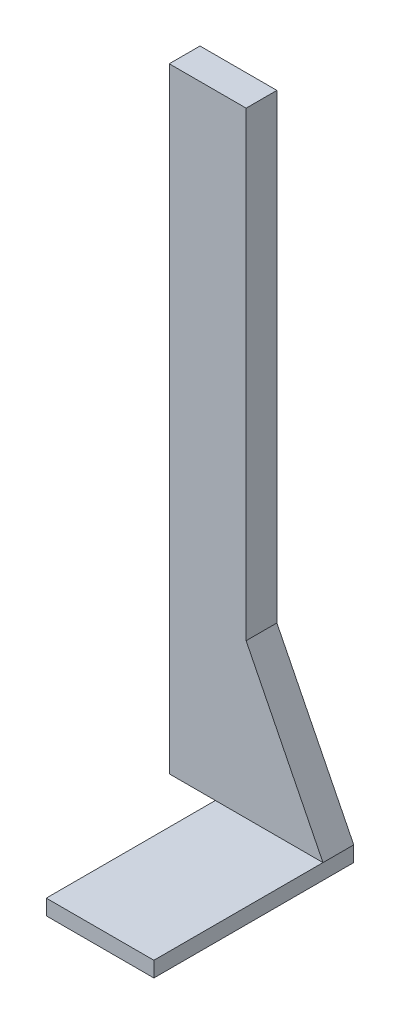
ISO-10303-21;
HEADER;
FILE_DESCRIPTION(('STEP AP214'),'2;1');
FILE_NAME('part.step','',(''),(''),'','','');
FILE_SCHEMA(('AUTOMOTIVE_DESIGN { 1 0 10303 214 1 1 1 1 }'));
ENDSEC;
DATA;
#1=APPLICATION_CONTEXT('core data for automotive mechanical design processes');
#2=APPLICATION_PROTOCOL_DEFINITION('international standard','automotive_design',2000,#1);
#3=PRODUCT_CONTEXT('',#1,'mechanical');
#4=PRODUCT('Part','Part','',(#3));
#5=PRODUCT_RELATED_PRODUCT_CATEGORY('part','',(#4));
#6=PRODUCT_DEFINITION_FORMATION('','',#4);
#7=PRODUCT_DEFINITION_CONTEXT('part definition',#1,'design');
#8=PRODUCT_DEFINITION('design','',#6,#7);
#9=PRODUCT_DEFINITION_SHAPE('','',#8);
#10=(LENGTH_UNIT() NAMED_UNIT(*) SI_UNIT(.MILLI.,.METRE.));
#11=(NAMED_UNIT(*) PLANE_ANGLE_UNIT() SI_UNIT($,.RADIAN.));
#12=(NAMED_UNIT(*) SI_UNIT($,.STERADIAN.) SOLID_ANGLE_UNIT());
#13=UNCERTAINTY_MEASURE_WITH_UNIT(LENGTH_MEASURE(1.E-05),#10,'distance_accuracy_value','');
#14=(GEOMETRIC_REPRESENTATION_CONTEXT(3) GLOBAL_UNCERTAINTY_ASSIGNED_CONTEXT((#13)) GLOBAL_UNIT_ASSIGNED_CONTEXT((#10,
#11,#12)) REPRESENTATION_CONTEXT('',''));
#15=CARTESIAN_POINT('',(0.,0.,0.));
#16=DIRECTION('',(0.,0.,1.));
#17=DIRECTION('',(1.,0.,0.));
#18=AXIS2_PLACEMENT_3D('',#15,#16,#17);
#19=CARTESIAN_POINT('',(0.,5.,0.));
#20=DIRECTION('',(-1.,0.,0.));
#21=DIRECTION('',(0.,0.,1.));
#22=AXIS2_PLACEMENT_3D('',#19,#20,#21);
#23=PLANE('',#22);
#24=DIRECTION('',(0.,0.,-1.));
#25=VECTOR('',#24,1.);
#26=CARTESIAN_POINT('',(0.,0.,0.));
#27=LINE('',#26,#25);
#28=CARTESIAN_POINT('',(0.,0.,65.));
#29=VERTEX_POINT('',#28);
#30=CARTESIAN_POINT('',(0.,0.,0.));
#31=VERTEX_POINT('',#30);
#32=EDGE_CURVE('E105',#29,#31,#27,.T.);
#33=ORIENTED_EDGE('',*,*,#32,.T.);
#34=DIRECTION('',(0.,-1.,0.));
#35=VECTOR('',#34,1.);
#36=CARTESIAN_POINT('',(0.,5.,0.));
#37=LINE('',#36,#35);
#38=CARTESIAN_POINT('',(0.,5.,0.));
#39=VERTEX_POINT('',#38);
#40=EDGE_CURVE('E11',#39,#31,#37,.T.);
#41=ORIENTED_EDGE('',*,*,#40,.F.);
#42=DIRECTION('',(0.,0.,-1.));
#43=VECTOR('',#42,1.);
#44=CARTESIAN_POINT('',(0.,5.,10.));
#45=LINE('',#44,#43);
#46=CARTESIAN_POINT('',(0.,5.,10.));
#47=VERTEX_POINT('',#46);
#48=EDGE_CURVE('E214',#47,#39,#45,.T.);
#49=ORIENTED_EDGE('',*,*,#48,.F.);
#50=DIRECTION('',(0.,0.,-1.));
#51=VECTOR('',#50,1.);
#52=CARTESIAN_POINT('',(0.,5.,0.));
#53=LINE('',#52,#51);
#54=CARTESIAN_POINT('',(0.,5.,65.));
#55=VERTEX_POINT('',#54);
#56=EDGE_CURVE('E99',#55,#47,#53,.T.);
#57=ORIENTED_EDGE('',*,*,#56,.F.);
#58=DIRECTION('',(0.,-1.,0.));
#59=VECTOR('',#58,1.);
#60=CARTESIAN_POINT('',(0.,5.,65.));
#61=LINE('',#60,#59);
#62=EDGE_CURVE('E91',#55,#29,#61,.T.);
#63=ORIENTED_EDGE('',*,*,#62,.T.);
#64=EDGE_LOOP('',(#33,#41,#49,#57,#63));
#65=FACE_BOUND('',#64,.T.);
#66=ADVANCED_FACE('F45',(#65),#23,.F.);
#67=CARTESIAN_POINT('',(0.,5.,0.));
#68=DIRECTION('',(0.,0.,1.));
#69=DIRECTION('',(1.,0.,0.));
#70=AXIS2_PLACEMENT_3D('',#67,#68,#69);
#71=PLANE('',#70);
#72=DIRECTION('',(-1.,0.,0.));
#73=VECTOR('',#72,1.);
#74=CARTESIAN_POINT('',(0.,0.,0.));
#75=LINE('',#74,#73);
#76=CARTESIAN_POINT('',(-35.,0.,0.));
#77=VERTEX_POINT('',#76);
#78=EDGE_CURVE('E110',#31,#77,#75,.T.);
#79=ORIENTED_EDGE('',*,*,#78,.T.);
#80=DIRECTION('',(0.,-1.,0.));
#81=VECTOR('',#80,1.);
#82=CARTESIAN_POINT('',(-35.,5.,0.));
#83=LINE('',#82,#81);
#84=CARTESIAN_POINT('',(-35.,5.,0.));
#85=VERTEX_POINT('',#84);
#86=EDGE_CURVE('E53',#85,#77,#83,.T.);
#87=ORIENTED_EDGE('',*,*,#86,.F.);
#88=DIRECTION('',(-1.,0.,0.));
#89=VECTOR('',#88,1.);
#90=CARTESIAN_POINT('',(0.,5.,0.));
#91=LINE('',#90,#89);
#92=CARTESIAN_POINT('',(-50.,5.,0.));
#93=VERTEX_POINT('',#92);
#94=EDGE_CURVE('E140',#85,#93,#91,.T.);
#95=ORIENTED_EDGE('',*,*,#94,.T.);
#96=DIRECTION('',(0.,1.,0.));
#97=VECTOR('',#96,1.);
#98=CARTESIAN_POINT('',(-50.,5.,0.));
#99=LINE('',#98,#97);
#100=CARTESIAN_POINT('',(-50.,205.,0.));
#101=VERTEX_POINT('',#100);
#102=EDGE_CURVE('E201',#93,#101,#99,.T.);
#103=ORIENTED_EDGE('',*,*,#102,.T.);
#104=DIRECTION('',(-1.,0.,0.));
#105=VECTOR('',#104,1.);
#106=CARTESIAN_POINT('',(-25.,205.,0.));
#107=LINE('',#106,#105);
#108=CARTESIAN_POINT('',(-25.,205.,0.));
#109=VERTEX_POINT('',#108);
#110=EDGE_CURVE('E198',#109,#101,#107,.T.);
#111=ORIENTED_EDGE('',*,*,#110,.F.);
#112=DIRECTION('',(0.,1.,0.));
#113=VECTOR('',#112,1.);
#114=CARTESIAN_POINT('',(-25.,55.,0.));
#115=LINE('',#114,#113);
#116=CARTESIAN_POINT('',(-25.,55.,0.));
#117=VERTEX_POINT('',#116);
#118=EDGE_CURVE('E194',#117,#109,#115,.T.);
#119=ORIENTED_EDGE('',*,*,#118,.F.);
#120=DIRECTION('',(-0.447213595499958,0.894427190999916,0.));
#121=VECTOR('',#120,1.);
#122=CARTESIAN_POINT('',(0.,5.,0.));
#123=LINE('',#122,#121);
#124=EDGE_CURVE('E190',#39,#117,#123,.T.);
#125=ORIENTED_EDGE('',*,*,#124,.F.);
#126=ORIENTED_EDGE('',*,*,#40,.T.);
#127=EDGE_LOOP('',(#79,#87,#95,#103,#111,#119,#125,#126));
#128=FACE_BOUND('',#127,.T.);
#129=ADVANCED_FACE('F136',(#128),#71,.F.);
#130=CARTESIAN_POINT('',(-35.,5.,0.));
#131=DIRECTION('',(1.,0.,0.));
#132=DIRECTION('',(0.,0.,-1.));
#133=AXIS2_PLACEMENT_3D('',#130,#131,#132);
#134=PLANE('',#133);
#135=DIRECTION('',(0.,0.,1.));
#136=VECTOR('',#135,1.);
#137=CARTESIAN_POINT('',(-35.,0.,0.));
#138=LINE('',#137,#136);
#139=CARTESIAN_POINT('',(-35.,0.,65.));
#140=VERTEX_POINT('',#139);
#141=EDGE_CURVE('E100',#77,#140,#138,.T.);
#142=ORIENTED_EDGE('',*,*,#141,.T.);
#143=DIRECTION('',(0.,-1.,0.));
#144=VECTOR('',#143,1.);
#145=CARTESIAN_POINT('',(-35.,5.,65.));
#146=LINE('',#145,#144);
#147=CARTESIAN_POINT('',(-35.,5.,65.));
#148=VERTEX_POINT('',#147);
#149=EDGE_CURVE('E94',#148,#140,#146,.T.);
#150=ORIENTED_EDGE('',*,*,#149,.F.);
#151=DIRECTION('',(0.,0.,1.));
#152=VECTOR('',#151,1.);
#153=CARTESIAN_POINT('',(-35.,5.,0.));
#154=LINE('',#153,#152);
#155=CARTESIAN_POINT('',(-35.,5.,10.));
#156=VERTEX_POINT('',#155);
#157=EDGE_CURVE('E223',#156,#148,#154,.T.);
#158=ORIENTED_EDGE('',*,*,#157,.F.);
#159=EDGE_CURVE('E133',#85,#156,#154,.T.);
#160=ORIENTED_EDGE('',*,*,#159,.F.);
#161=ORIENTED_EDGE('',*,*,#86,.T.);
#162=EDGE_LOOP('',(#142,#150,#158,#160,#161));
#163=FACE_BOUND('',#162,.T.);
#164=ADVANCED_FACE('F131',(#163),#134,.F.);
#165=CARTESIAN_POINT('',(0.,5.,65.));
#166=DIRECTION('',(0.,0.,-1.));
#167=DIRECTION('',(-1.,0.,0.));
#168=AXIS2_PLACEMENT_3D('',#165,#166,#167);
#169=PLANE('',#168);
#170=DIRECTION('',(1.,0.,0.));
#171=VECTOR('',#170,1.);
#172=CARTESIAN_POINT('',(0.,0.,65.));
#173=LINE('',#172,#171);
#174=EDGE_CURVE('E88',#140,#29,#173,.T.);
#175=ORIENTED_EDGE('',*,*,#174,.T.);
#176=ORIENTED_EDGE('',*,*,#62,.F.);
#177=DIRECTION('',(1.,0.,0.));
#178=VECTOR('',#177,1.);
#179=CARTESIAN_POINT('',(0.,5.,65.));
#180=LINE('',#179,#178);
#181=EDGE_CURVE('E69',#148,#55,#180,.T.);
#182=ORIENTED_EDGE('',*,*,#181,.F.);
#183=ORIENTED_EDGE('',*,*,#149,.T.);
#184=EDGE_LOOP('',(#175,#176,#182,#183));
#185=FACE_BOUND('',#184,.T.);
#186=ADVANCED_FACE('F90',(#185),#169,.F.);
#187=CARTESIAN_POINT('',(0.,5.,0.));
#188=DIRECTION('',(0.,-1.,0.));
#189=DIRECTION('',(0.,0.,-1.));
#190=AXIS2_PLACEMENT_3D('',#187,#188,#189);
#191=PLANE('',#190);
#192=ORIENTED_EDGE('',*,*,#56,.T.);
#193=DIRECTION('',(-1.,0.,0.));
#194=VECTOR('',#193,1.);
#195=CARTESIAN_POINT('',(0.,5.,10.));
#196=LINE('',#195,#194);
#197=EDGE_CURVE('E229',#47,#156,#196,.T.);
#198=ORIENTED_EDGE('',*,*,#197,.T.);
#199=ORIENTED_EDGE('',*,*,#157,.T.);
#200=ORIENTED_EDGE('',*,*,#181,.T.);
#201=EDGE_LOOP('',(#192,#198,#199,#200));
#202=FACE_BOUND('',#201,.T.);
#203=ADVANCED_FACE('F228',(#202),#191,.F.);
#204=CARTESIAN_POINT('',(0.,0.,0.));
#205=DIRECTION('',(0.,-1.,0.));
#206=DIRECTION('',(0.,0.,-1.));
#207=AXIS2_PLACEMENT_3D('',#204,#205,#206);
#208=PLANE('',#207);
#209=ORIENTED_EDGE('',*,*,#32,.F.);
#210=ORIENTED_EDGE('',*,*,#174,.F.);
#211=ORIENTED_EDGE('',*,*,#141,.F.);
#212=ORIENTED_EDGE('',*,*,#78,.F.);
#213=EDGE_LOOP('',(#209,#210,#211,#212));
#214=FACE_BOUND('',#213,.T.);
#215=ADVANCED_FACE('F109',(#214),#208,.T.);
#216=CARTESIAN_POINT('',(-25.,55.,10.));
#217=DIRECTION('',(-1.,0.,0.));
#218=DIRECTION('',(0.,-1.,0.));
#219=AXIS2_PLACEMENT_3D('',#216,#217,#218);
#220=PLANE('',#219);
#221=ORIENTED_EDGE('',*,*,#118,.T.);
#222=DIRECTION('',(0.,0.,-1.));
#223=VECTOR('',#222,1.);
#224=CARTESIAN_POINT('',(-25.,205.,10.));
#225=LINE('',#224,#223);
#226=CARTESIAN_POINT('',(-25.,205.,10.));
#227=VERTEX_POINT('',#226);
#228=EDGE_CURVE('E112',#227,#109,#225,.T.);
#229=ORIENTED_EDGE('',*,*,#228,.F.);
#230=DIRECTION('',(0.,1.,0.));
#231=VECTOR('',#230,1.);
#232=CARTESIAN_POINT('',(-25.,55.,10.));
#233=LINE('',#232,#231);
#234=CARTESIAN_POINT('',(-25.,55.,10.));
#235=VERTEX_POINT('',#234);
#236=EDGE_CURVE('E181',#235,#227,#233,.T.);
#237=ORIENTED_EDGE('',*,*,#236,.F.);
#238=DIRECTION('',(0.,0.,-1.));
#239=VECTOR('',#238,1.);
#240=CARTESIAN_POINT('',(-25.,55.,10.));
#241=LINE('',#240,#239);
#242=EDGE_CURVE('E195',#235,#117,#241,.T.);
#243=ORIENTED_EDGE('',*,*,#242,.T.);
#244=EDGE_LOOP('',(#221,#229,#237,#243));
#245=FACE_BOUND('',#244,.T.);
#246=ADVANCED_FACE('F192',(#245),#220,.F.);
#247=CARTESIAN_POINT('',(-25.,205.,10.));
#248=DIRECTION('',(0.,-1.,0.));
#249=DIRECTION('',(0.,0.,-1.));
#250=AXIS2_PLACEMENT_3D('',#247,#248,#249);
#251=PLANE('',#250);
#252=ORIENTED_EDGE('',*,*,#110,.T.);
#253=DIRECTION('',(0.,0.,-1.));
#254=VECTOR('',#253,1.);
#255=CARTESIAN_POINT('',(-50.,205.,10.));
#256=LINE('',#255,#254);
#257=CARTESIAN_POINT('',(-50.,205.,10.));
#258=VERTEX_POINT('',#257);
#259=EDGE_CURVE('E118',#258,#101,#256,.T.);
#260=ORIENTED_EDGE('',*,*,#259,.F.);
#261=DIRECTION('',(-1.,0.,0.));
#262=VECTOR('',#261,1.);
#263=CARTESIAN_POINT('',(-25.,205.,10.));
#264=LINE('',#263,#262);
#265=EDGE_CURVE('E172',#227,#258,#264,.T.);
#266=ORIENTED_EDGE('',*,*,#265,.F.);
#267=ORIENTED_EDGE('',*,*,#228,.T.);
#268=EDGE_LOOP('',(#252,#260,#266,#267));
#269=FACE_BOUND('',#268,.T.);
#270=ADVANCED_FACE('F175',(#269),#251,.F.);
#271=CARTESIAN_POINT('',(-50.,5.,10.));
#272=DIRECTION('',(-1.,0.,0.));
#273=DIRECTION('',(0.,0.,1.));
#274=AXIS2_PLACEMENT_3D('',#271,#272,#273);
#275=PLANE('',#274);
#276=ORIENTED_EDGE('',*,*,#102,.F.);
#277=DIRECTION('',(0.,0.,-1.));
#278=VECTOR('',#277,1.);
#279=CARTESIAN_POINT('',(-50.,5.,10.));
#280=LINE('',#279,#278);
#281=CARTESIAN_POINT('',(-50.,5.,10.));
#282=VERTEX_POINT('',#281);
#283=EDGE_CURVE('E217',#282,#93,#280,.T.);
#284=ORIENTED_EDGE('',*,*,#283,.F.);
#285=DIRECTION('',(0.,1.,0.));
#286=VECTOR('',#285,1.);
#287=CARTESIAN_POINT('',(-50.,5.,10.));
#288=LINE('',#287,#286);
#289=EDGE_CURVE('E180',#282,#258,#288,.T.);
#290=ORIENTED_EDGE('',*,*,#289,.T.);
#291=ORIENTED_EDGE('',*,*,#259,.T.);
#292=EDGE_LOOP('',(#276,#284,#290,#291));
#293=FACE_BOUND('',#292,.T.);
#294=ADVANCED_FACE('F238',(#293),#275,.T.);
#295=CARTESIAN_POINT('',(0.,5.,10.));
#296=DIRECTION('',(0.,-1.,0.));
#297=DIRECTION('',(0.,0.,-1.));
#298=AXIS2_PLACEMENT_3D('',#295,#296,#297);
#299=PLANE('',#298);
#300=ORIENTED_EDGE('',*,*,#94,.F.);
#301=ORIENTED_EDGE('',*,*,#159,.T.);
#302=EDGE_CURVE('E60',#156,#282,#196,.T.);
#303=ORIENTED_EDGE('',*,*,#302,.T.);
#304=ORIENTED_EDGE('',*,*,#283,.T.);
#305=EDGE_LOOP('',(#300,#301,#303,#304));
#306=FACE_BOUND('',#305,.T.);
#307=ADVANCED_FACE('F239',(#306),#299,.T.);
#308=CARTESIAN_POINT('',(0.,5.,10.));
#309=DIRECTION('',(-0.894427190999916,-0.447213595499958,0.));
#310=DIRECTION('',(0.447213595499958,-0.894427190999916,0.));
#311=AXIS2_PLACEMENT_3D('',#308,#309,#310);
#312=PLANE('',#311);
#313=ORIENTED_EDGE('',*,*,#124,.T.);
#314=ORIENTED_EDGE('',*,*,#242,.F.);
#315=DIRECTION('',(-0.447213595499958,0.894427190999916,0.));
#316=VECTOR('',#315,1.);
#317=CARTESIAN_POINT('',(0.,5.,10.));
#318=LINE('',#317,#316);
#319=EDGE_CURVE('E185',#47,#235,#318,.T.);
#320=ORIENTED_EDGE('',*,*,#319,.F.);
#321=ORIENTED_EDGE('',*,*,#48,.T.);
#322=EDGE_LOOP('',(#313,#314,#320,#321));
#323=FACE_BOUND('',#322,.T.);
#324=ADVANCED_FACE('F241',(#323),#312,.F.);
#325=CARTESIAN_POINT('',(0.,0.,10.));
#326=DIRECTION('',(0.,0.,1.));
#327=DIRECTION('',(1.,0.,0.));
#328=AXIS2_PLACEMENT_3D('',#325,#326,#327);
#329=PLANE('',#328);
#330=ORIENTED_EDGE('',*,*,#236,.T.);
#331=ORIENTED_EDGE('',*,*,#265,.T.);
#332=ORIENTED_EDGE('',*,*,#289,.F.);
#333=ORIENTED_EDGE('',*,*,#302,.F.);
#334=ORIENTED_EDGE('',*,*,#197,.F.);
#335=ORIENTED_EDGE('',*,*,#319,.T.);
#336=EDGE_LOOP('',(#330,#331,#332,#333,#334,#335));
#337=FACE_BOUND('',#336,.T.);
#338=ADVANCED_FACE('F184',(#337),#329,.T.);
#339=CLOSED_SHELL('',(#66,#129,#164,#186,#203,#215,#246,#270,#294,#307,#324,#338));
#340=MANIFOLD_SOLID_BREP('B2',#339);
#341=ADVANCED_BREP_SHAPE_REPRESENTATION('',(#18,#340),#14);
#342=SHAPE_DEFINITION_REPRESENTATION(#9,#341);
ENDSEC;
END-ISO-10303-21;
